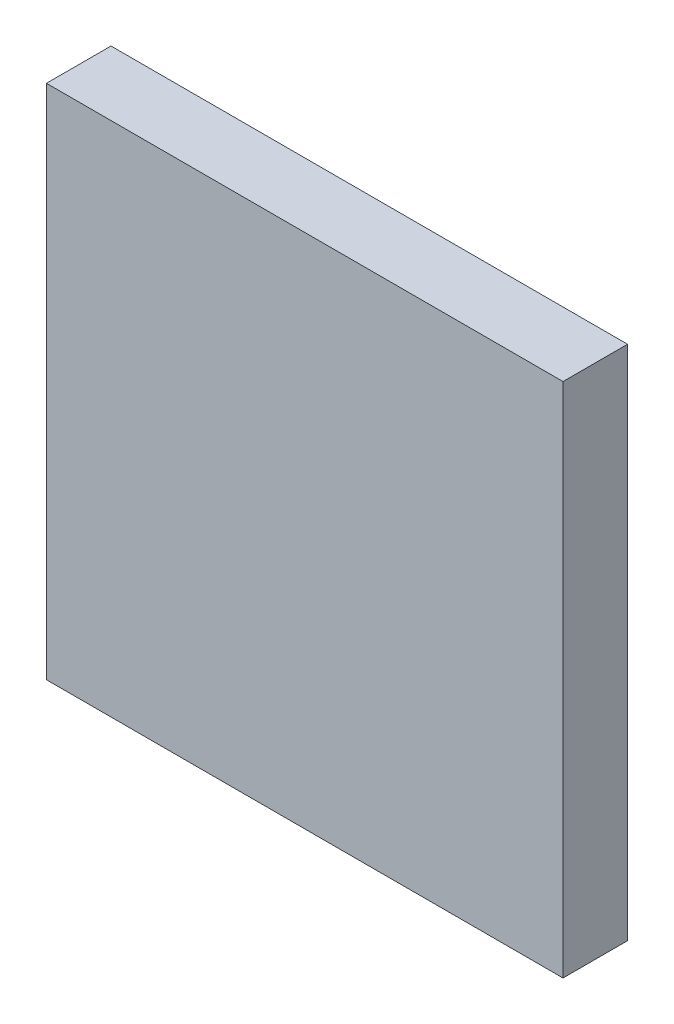
ISO-10303-21;
HEADER;
FILE_DESCRIPTION(('STEP AP214'),'2;1');
FILE_NAME('part.step','',(''),(''),'','','');
FILE_SCHEMA(('AUTOMOTIVE_DESIGN { 1 0 10303 214 1 1 1 1 }'));
ENDSEC;
DATA;
#1=APPLICATION_CONTEXT('core data for automotive mechanical design processes');
#2=APPLICATION_PROTOCOL_DEFINITION('international standard','automotive_design',2000,#1);
#3=PRODUCT_CONTEXT('',#1,'mechanical');
#4=PRODUCT('Part','Part','',(#3));
#5=PRODUCT_RELATED_PRODUCT_CATEGORY('part','',(#4));
#6=PRODUCT_DEFINITION_FORMATION('','',#4);
#7=PRODUCT_DEFINITION_CONTEXT('part definition',#1,'design');
#8=PRODUCT_DEFINITION('design','',#6,#7);
#9=PRODUCT_DEFINITION_SHAPE('','',#8);
#10=(LENGTH_UNIT() NAMED_UNIT(*) SI_UNIT(.MILLI.,.METRE.));
#11=(NAMED_UNIT(*) PLANE_ANGLE_UNIT() SI_UNIT($,.RADIAN.));
#12=(NAMED_UNIT(*) SI_UNIT($,.STERADIAN.) SOLID_ANGLE_UNIT());
#13=UNCERTAINTY_MEASURE_WITH_UNIT(LENGTH_MEASURE(1.E-05),#10,'distance_accuracy_value','');
#14=(GEOMETRIC_REPRESENTATION_CONTEXT(3) GLOBAL_UNCERTAINTY_ASSIGNED_CONTEXT((#13)) GLOBAL_UNIT_ASSIGNED_CONTEXT((#10,
#11,#12)) REPRESENTATION_CONTEXT('',''));
#15=CARTESIAN_POINT('',(0.,0.,0.));
#16=DIRECTION('',(0.,0.,1.));
#17=DIRECTION('',(1.,0.,0.));
#18=AXIS2_PLACEMENT_3D('',#15,#16,#17);
#19=CARTESIAN_POINT('',(0.,0.,1.));
#20=DIRECTION('',(1.,0.,0.));
#21=DIRECTION('',(0.,0.,-1.));
#22=AXIS2_PLACEMENT_3D('',#19,#20,#21);
#23=PLANE('',#22);
#24=DIRECTION('',(0.,-1.,0.));
#25=VECTOR('',#24,1.);
#26=CARTESIAN_POINT('',(0.,0.,0.));
#27=LINE('',#26,#25);
#28=CARTESIAN_POINT('',(0.,8.,0.));
#29=VERTEX_POINT('',#28);
#30=CARTESIAN_POINT('',(0.,0.,0.));
#31=VERTEX_POINT('',#30);
#32=EDGE_CURVE('E108',#29,#31,#27,.T.);
#33=ORIENTED_EDGE('',*,*,#32,.T.);
#34=DIRECTION('',(0.,0.,-1.));
#35=VECTOR('',#34,1.);
#36=CARTESIAN_POINT('',(0.,0.,1.));
#37=LINE('',#36,#35);
#38=CARTESIAN_POINT('',(0.,0.,1.));
#39=VERTEX_POINT('',#38);
#40=EDGE_CURVE('E11',#39,#31,#37,.T.);
#41=ORIENTED_EDGE('',*,*,#40,.F.);
#42=DIRECTION('',(0.,-1.,0.));
#43=VECTOR('',#42,1.);
#44=CARTESIAN_POINT('',(0.,0.,1.));
#45=LINE('',#44,#43);
#46=CARTESIAN_POINT('',(0.,8.,1.));
#47=VERTEX_POINT('',#46);
#48=EDGE_CURVE('E92',#47,#39,#45,.T.);
#49=ORIENTED_EDGE('',*,*,#48,.F.);
#50=DIRECTION('',(0.,0.,-1.));
#51=VECTOR('',#50,1.);
#52=CARTESIAN_POINT('',(0.,8.,1.));
#53=LINE('',#52,#51);
#54=EDGE_CURVE('E105',#47,#29,#53,.T.);
#55=ORIENTED_EDGE('',*,*,#54,.T.);
#56=EDGE_LOOP('',(#33,#41,#49,#55));
#57=FACE_BOUND('',#56,.T.);
#58=ADVANCED_FACE('F43',(#57),#23,.F.);
#59=CARTESIAN_POINT('',(0.,0.,1.));
#60=DIRECTION('',(0.,1.,0.));
#61=DIRECTION('',(0.,0.,1.));
#62=AXIS2_PLACEMENT_3D('',#59,#60,#61);
#63=PLANE('',#62);
#64=DIRECTION('',(1.,0.,0.));
#65=VECTOR('',#64,1.);
#66=CARTESIAN_POINT('',(0.,0.,0.));
#67=LINE('',#66,#65);
#68=CARTESIAN_POINT('',(8.,0.,0.));
#69=VERTEX_POINT('',#68);
#70=EDGE_CURVE('E97',#31,#69,#67,.T.);
#71=ORIENTED_EDGE('',*,*,#70,.T.);
#72=DIRECTION('',(0.,0.,-1.));
#73=VECTOR('',#72,1.);
#74=CARTESIAN_POINT('',(8.,0.,1.));
#75=LINE('',#74,#73);
#76=CARTESIAN_POINT('',(8.,0.,1.));
#77=VERTEX_POINT('',#76);
#78=EDGE_CURVE('E51',#77,#69,#75,.T.);
#79=ORIENTED_EDGE('',*,*,#78,.F.);
#80=DIRECTION('',(1.,0.,0.));
#81=VECTOR('',#80,1.);
#82=CARTESIAN_POINT('',(0.,0.,1.));
#83=LINE('',#82,#81);
#84=EDGE_CURVE('E87',#39,#77,#83,.T.);
#85=ORIENTED_EDGE('',*,*,#84,.F.);
#86=ORIENTED_EDGE('',*,*,#40,.T.);
#87=EDGE_LOOP('',(#71,#79,#85,#86));
#88=FACE_BOUND('',#87,.T.);
#89=ADVANCED_FACE('F100',(#88),#63,.F.);
#90=CARTESIAN_POINT('',(8.,0.,1.));
#91=DIRECTION('',(-1.,0.,0.));
#92=DIRECTION('',(0.,0.,1.));
#93=AXIS2_PLACEMENT_3D('',#90,#91,#92);
#94=PLANE('',#93);
#95=DIRECTION('',(0.,1.,0.));
#96=VECTOR('',#95,1.);
#97=CARTESIAN_POINT('',(8.,0.,0.));
#98=LINE('',#97,#96);
#99=CARTESIAN_POINT('',(8.,8.,0.));
#100=VERTEX_POINT('',#99);
#101=EDGE_CURVE('E78',#69,#100,#98,.T.);
#102=ORIENTED_EDGE('',*,*,#101,.T.);
#103=DIRECTION('',(0.,0.,-1.));
#104=VECTOR('',#103,1.);
#105=CARTESIAN_POINT('',(8.,8.,1.));
#106=LINE('',#105,#104);
#107=CARTESIAN_POINT('',(8.,8.,1.));
#108=VERTEX_POINT('',#107);
#109=EDGE_CURVE('E98',#108,#100,#106,.T.);
#110=ORIENTED_EDGE('',*,*,#109,.F.);
#111=DIRECTION('',(0.,1.,0.));
#112=VECTOR('',#111,1.);
#113=CARTESIAN_POINT('',(8.,0.,1.));
#114=LINE('',#113,#112);
#115=EDGE_CURVE('E95',#77,#108,#114,.T.);
#116=ORIENTED_EDGE('',*,*,#115,.F.);
#117=ORIENTED_EDGE('',*,*,#78,.T.);
#118=EDGE_LOOP('',(#102,#110,#116,#117));
#119=FACE_BOUND('',#118,.T.);
#120=ADVANCED_FACE('F99',(#119),#94,.F.);
#121=CARTESIAN_POINT('',(0.,8.,1.));
#122=DIRECTION('',(0.,-1.,0.));
#123=DIRECTION('',(0.,0.,-1.));
#124=AXIS2_PLACEMENT_3D('',#121,#122,#123);
#125=PLANE('',#124);
#126=DIRECTION('',(-1.,0.,0.));
#127=VECTOR('',#126,1.);
#128=CARTESIAN_POINT('',(0.,8.,0.));
#129=LINE('',#128,#127);
#130=EDGE_CURVE('E85',#100,#29,#129,.T.);
#131=ORIENTED_EDGE('',*,*,#130,.T.);
#132=ORIENTED_EDGE('',*,*,#54,.F.);
#133=DIRECTION('',(-1.,0.,0.));
#134=VECTOR('',#133,1.);
#135=CARTESIAN_POINT('',(0.,8.,1.));
#136=LINE('',#135,#134);
#137=EDGE_CURVE('E56',#108,#47,#136,.T.);
#138=ORIENTED_EDGE('',*,*,#137,.F.);
#139=ORIENTED_EDGE('',*,*,#109,.T.);
#140=EDGE_LOOP('',(#131,#132,#138,#139));
#141=FACE_BOUND('',#140,.T.);
#142=ADVANCED_FACE('F111',(#141),#125,.F.);
#143=CARTESIAN_POINT('',(0.,0.,1.));
#144=DIRECTION('',(0.,0.,-1.));
#145=DIRECTION('',(-1.,0.,0.));
#146=AXIS2_PLACEMENT_3D('',#143,#144,#145);
#147=PLANE('',#146);
#148=ORIENTED_EDGE('',*,*,#48,.T.);
#149=ORIENTED_EDGE('',*,*,#84,.T.);
#150=ORIENTED_EDGE('',*,*,#115,.T.);
#151=ORIENTED_EDGE('',*,*,#137,.T.);
#152=EDGE_LOOP('',(#148,#149,#150,#151));
#153=FACE_BOUND('',#152,.T.);
#154=ADVANCED_FACE('F89',(#153),#147,.F.);
#155=CARTESIAN_POINT('',(0.,0.,0.));
#156=DIRECTION('',(0.,0.,-1.));
#157=DIRECTION('',(-1.,0.,0.));
#158=AXIS2_PLACEMENT_3D('',#155,#156,#157);
#159=PLANE('',#158);
#160=ORIENTED_EDGE('',*,*,#32,.F.);
#161=ORIENTED_EDGE('',*,*,#130,.F.);
#162=ORIENTED_EDGE('',*,*,#101,.F.);
#163=ORIENTED_EDGE('',*,*,#70,.F.);
#164=EDGE_LOOP('',(#160,#161,#162,#163));
#165=FACE_BOUND('',#164,.T.);
#166=ADVANCED_FACE('F118',(#165),#159,.T.);
#167=CLOSED_SHELL('',(#58,#89,#120,#142,#154,#166));
#168=MANIFOLD_SOLID_BREP('B2',#167);
#169=ADVANCED_BREP_SHAPE_REPRESENTATION('',(#18,#168),#14);
#170=SHAPE_DEFINITION_REPRESENTATION(#9,#169);
ENDSEC;
END-ISO-10303-21;
